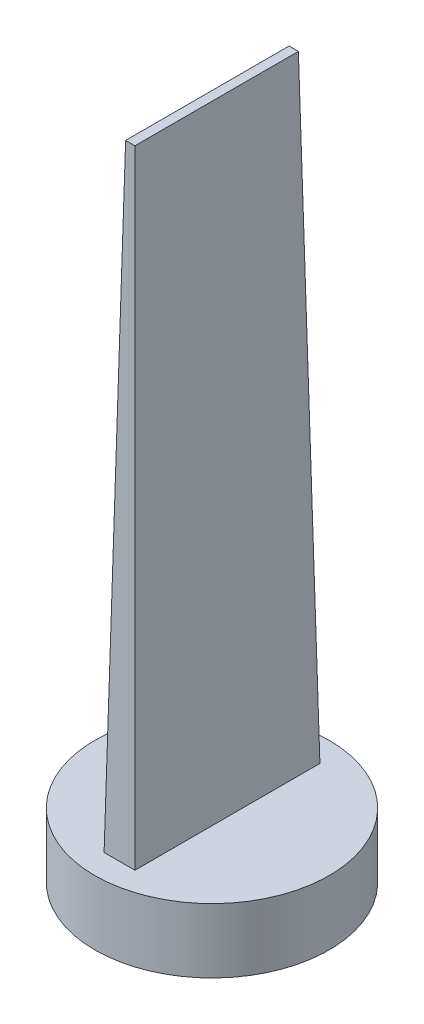
ISO-10303-21;
HEADER;
FILE_DESCRIPTION(('STEP AP214'),'2;1');
FILE_NAME('part.step','',(''),(''),'','','');
FILE_SCHEMA(('AUTOMOTIVE_DESIGN { 1 0 10303 214 1 1 1 1 }'));
ENDSEC;
DATA;
#1=APPLICATION_CONTEXT('core data for automotive mechanical design processes');
#2=APPLICATION_PROTOCOL_DEFINITION('international standard','automotive_design',2000,#1);
#3=PRODUCT_CONTEXT('',#1,'mechanical');
#4=PRODUCT('Part','Part','',(#3));
#5=PRODUCT_RELATED_PRODUCT_CATEGORY('part','',(#4));
#6=PRODUCT_DEFINITION_FORMATION('','',#4);
#7=PRODUCT_DEFINITION_CONTEXT('part definition',#1,'design');
#8=PRODUCT_DEFINITION('design','',#6,#7);
#9=PRODUCT_DEFINITION_SHAPE('','',#8);
#10=(LENGTH_UNIT() NAMED_UNIT(*) SI_UNIT(.MILLI.,.METRE.));
#11=(NAMED_UNIT(*) PLANE_ANGLE_UNIT() SI_UNIT($,.RADIAN.));
#12=(NAMED_UNIT(*) SI_UNIT($,.STERADIAN.) SOLID_ANGLE_UNIT());
#13=UNCERTAINTY_MEASURE_WITH_UNIT(LENGTH_MEASURE(1.E-05),#10,'distance_accuracy_value','');
#14=(GEOMETRIC_REPRESENTATION_CONTEXT(3) GLOBAL_UNCERTAINTY_ASSIGNED_CONTEXT((#13)) GLOBAL_UNIT_ASSIGNED_CONTEXT((#10,
#11,#12)) REPRESENTATION_CONTEXT('',''));
#15=CARTESIAN_POINT('',(0.,0.,0.));
#16=DIRECTION('',(0.,0.,1.));
#17=DIRECTION('',(1.,0.,0.));
#18=AXIS2_PLACEMENT_3D('',#15,#16,#17);
#19=CARTESIAN_POINT('',(0.,10.45,0.));
#20=DIRECTION('',(0.,-1.,0.));
#21=DIRECTION('',(0.,0.,-1.));
#22=AXIS2_PLACEMENT_3D('',#19,#20,#21);
#23=CYLINDRICAL_SURFACE('',#22,19.);
#24=CARTESIAN_POINT('',(0.,10.45,0.));
#25=DIRECTION('',(0.,1.,0.));
#26=DIRECTION('',(0.,0.,1.));
#27=AXIS2_PLACEMENT_3D('',#24,#25,#26);
#28=CIRCLE('',#27,19.);
#29=CARTESIAN_POINT('',(0.,10.45,19.));
#30=VERTEX_POINT('',#29);
#31=EDGE_CURVE('E11',#30,#30,#28,.T.);
#32=ORIENTED_EDGE('',*,*,#31,.F.);
#33=EDGE_LOOP('',(#32));
#34=FACE_BOUND('',#33,.T.);
#35=CARTESIAN_POINT('',(0.,0.,0.));
#36=DIRECTION('',(0.,1.,0.));
#37=DIRECTION('',(0.,0.,1.));
#38=AXIS2_PLACEMENT_3D('',#35,#36,#37);
#39=CIRCLE('',#38,19.);
#40=CARTESIAN_POINT('',(0.,0.,19.));
#41=VERTEX_POINT('',#40);
#42=EDGE_CURVE('E36',#41,#41,#39,.T.);
#43=ORIENTED_EDGE('',*,*,#42,.T.);
#44=EDGE_LOOP('',(#43));
#45=FACE_BOUND('',#44,.T.);
#46=ADVANCED_FACE('F33',(#34,#45),#23,.T.);
#47=CARTESIAN_POINT('',(0.,10.45,0.));
#48=DIRECTION('',(0.,1.,0.));
#49=DIRECTION('',(0.,0.,1.));
#50=AXIS2_PLACEMENT_3D('',#47,#48,#49);
#51=PLANE('',#50);
#52=DIRECTION('',(1.,0.,0.));
#53=VECTOR('',#52,1.);
#54=CARTESIAN_POINT('',(2.5,10.45,15.));
#55=LINE('',#54,#53);
#56=CARTESIAN_POINT('',(-2.5,10.45,15.));
#57=VERTEX_POINT('',#56);
#58=CARTESIAN_POINT('',(2.5,10.45,15.));
#59=VERTEX_POINT('',#58);
#60=EDGE_CURVE('E47',#57,#59,#55,.T.);
#61=ORIENTED_EDGE('',*,*,#60,.F.);
#62=DIRECTION('',(0.,0.,1.));
#63=VECTOR('',#62,1.);
#64=CARTESIAN_POINT('',(-2.5,10.45,15.));
#65=LINE('',#64,#63);
#66=CARTESIAN_POINT('',(-2.5,10.45,-15.));
#67=VERTEX_POINT('',#66);
#68=EDGE_CURVE('E51',#67,#57,#65,.T.);
#69=ORIENTED_EDGE('',*,*,#68,.F.);
#70=DIRECTION('',(-1.,0.,0.));
#71=VECTOR('',#70,1.);
#72=CARTESIAN_POINT('',(2.5,10.45,-15.));
#73=LINE('',#72,#71);
#74=CARTESIAN_POINT('',(2.5,10.45,-15.));
#75=VERTEX_POINT('',#74);
#76=EDGE_CURVE('E68',#75,#67,#73,.T.);
#77=ORIENTED_EDGE('',*,*,#76,.F.);
#78=DIRECTION('',(0.,0.,-1.));
#79=VECTOR('',#78,1.);
#80=CARTESIAN_POINT('',(2.5,10.45,15.));
#81=LINE('',#80,#79);
#82=EDGE_CURVE('E72',#59,#75,#81,.T.);
#83=ORIENTED_EDGE('',*,*,#82,.F.);
#84=EDGE_LOOP('',(#61,#69,#77,#83));
#85=FACE_BOUND('',#84,.T.);
#86=ORIENTED_EDGE('',*,*,#31,.T.);
#87=EDGE_LOOP('',(#86));
#88=FACE_BOUND('',#87,.T.);
#89=ADVANCED_FACE('F70',(#85,#88),#51,.T.);
#90=CARTESIAN_POINT('',(0.,0.,0.));
#91=DIRECTION('',(0.,1.,0.));
#92=DIRECTION('',(0.,0.,1.));
#93=AXIS2_PLACEMENT_3D('',#90,#91,#92);
#94=PLANE('',#93);
#95=ORIENTED_EDGE('',*,*,#42,.F.);
#96=EDGE_LOOP('',(#95));
#97=FACE_BOUND('',#96,.T.);
#98=ADVANCED_FACE('F129',(#97),#94,.F.);
#99=CARTESIAN_POINT('',(2.5,10.45,15.));
#100=DIRECTION('',(0.,0.0174524064372835,0.999847695156391));
#101=DIRECTION('',(0.,-0.999847695156391,0.0174524064372835));
#102=AXIS2_PLACEMENT_3D('',#99,#100,#101);
#103=PLANE('',#102);
#104=ORIENTED_EDGE('',*,*,#60,.T.);
#105=DIRECTION('',(0.0174497491606827,-0.999695459881887,0.0174497491606827));
#106=VECTOR('',#105,1.);
#107=CARTESIAN_POINT('',(2.5,10.45,15.));
#108=LINE('',#107,#106);
#109=CARTESIAN_POINT('',(0.754493507178238,110.45,13.2544935071782));
#110=VERTEX_POINT('',#109);
#111=EDGE_CURVE('E85',#110,#59,#108,.T.);
#112=ORIENTED_EDGE('',*,*,#111,.F.);
#113=DIRECTION('',(-1.,0.,0.));
#114=VECTOR('',#113,1.);
#115=CARTESIAN_POINT('',(0.,110.45,13.2544935071782));
#116=LINE('',#115,#114);
#117=CARTESIAN_POINT('',(-0.754493507178238,110.45,13.2544935071782));
#118=VERTEX_POINT('',#117);
#119=EDGE_CURVE('E96',#118,#110,#116,.F.);
#120=ORIENTED_EDGE('',*,*,#119,.F.);
#121=DIRECTION('',(-0.0174497491606827,-0.999695459881887,0.0174497491606827));
#122=VECTOR('',#121,1.);
#123=CARTESIAN_POINT('',(-2.49847753127115,10.5372221750601,14.9984775312711));
#124=LINE('',#123,#122);
#125=EDGE_CURVE('E92',#118,#57,#124,.T.);
#126=ORIENTED_EDGE('',*,*,#125,.T.);
#127=EDGE_LOOP('',(#104,#112,#120,#126));
#128=FACE_BOUND('',#127,.T.);
#129=ADVANCED_FACE('F111',(#128),#103,.T.);
#130=CARTESIAN_POINT('',(2.5,10.45,15.));
#131=DIRECTION('',(0.999847695156391,0.0174524064372835,0.));
#132=DIRECTION('',(-0.0174524064372835,0.999847695156391,0.));
#133=AXIS2_PLACEMENT_3D('',#130,#131,#132);
#134=PLANE('',#133);
#135=ORIENTED_EDGE('',*,*,#82,.T.);
#136=DIRECTION('',(0.0174497491606827,-0.999695459881887,-0.0174497491606827));
#137=VECTOR('',#136,1.);
#138=CARTESIAN_POINT('',(2.5,10.45,-15.));
#139=LINE('',#138,#137);
#140=CARTESIAN_POINT('',(0.754493507178238,110.45,-13.2544935071782));
#141=VERTEX_POINT('',#140);
#142=EDGE_CURVE('E82',#141,#75,#139,.T.);
#143=ORIENTED_EDGE('',*,*,#142,.F.);
#144=DIRECTION('',(0.,0.,1.));
#145=VECTOR('',#144,1.);
#146=CARTESIAN_POINT('',(0.754493507178238,110.45,0.));
#147=LINE('',#146,#145);
#148=EDGE_CURVE('E99',#110,#141,#147,.F.);
#149=ORIENTED_EDGE('',*,*,#148,.F.);
#150=ORIENTED_EDGE('',*,*,#111,.T.);
#151=EDGE_LOOP('',(#135,#143,#149,#150));
#152=FACE_BOUND('',#151,.T.);
#153=ADVANCED_FACE('F81',(#152),#134,.T.);
#154=CARTESIAN_POINT('',(2.5,10.45,-15.));
#155=DIRECTION('',(0.,0.0174524064372835,-0.999847695156391));
#156=DIRECTION('',(0.,0.999847695156391,0.0174524064372835));
#157=AXIS2_PLACEMENT_3D('',#154,#155,#156);
#158=PLANE('',#157);
#159=ORIENTED_EDGE('',*,*,#76,.T.);
#160=DIRECTION('',(-0.0174497491606827,-0.999695459881887,-0.0174497491606827));
#161=VECTOR('',#160,1.);
#162=CARTESIAN_POINT('',(-2.49086518762688,10.9733330503604,-14.9908651876269));
#163=LINE('',#162,#161);
#164=CARTESIAN_POINT('',(-0.754493507178238,110.45,-13.2544935071782));
#165=VERTEX_POINT('',#164);
#166=EDGE_CURVE('E89',#165,#67,#163,.T.);
#167=ORIENTED_EDGE('',*,*,#166,.F.);
#168=DIRECTION('',(1.,0.,0.));
#169=VECTOR('',#168,1.);
#170=CARTESIAN_POINT('',(0.,110.45,-13.2544935071782));
#171=LINE('',#170,#169);
#172=EDGE_CURVE('E88',#141,#165,#171,.F.);
#173=ORIENTED_EDGE('',*,*,#172,.F.);
#174=ORIENTED_EDGE('',*,*,#142,.T.);
#175=EDGE_LOOP('',(#159,#167,#173,#174));
#176=FACE_BOUND('',#175,.T.);
#177=ADVANCED_FACE('F87',(#176),#158,.T.);
#178=CARTESIAN_POINT('',(-2.5,10.45,15.));
#179=DIRECTION('',(-0.999847695156391,0.0174524064372835,0.));
#180=DIRECTION('',(-0.0174524064372835,-0.999847695156391,0.));
#181=AXIS2_PLACEMENT_3D('',#178,#179,#180);
#182=PLANE('',#181);
#183=ORIENTED_EDGE('',*,*,#68,.T.);
#184=ORIENTED_EDGE('',*,*,#125,.F.);
#185=DIRECTION('',(0.,0.,-1.));
#186=VECTOR('',#185,1.);
#187=CARTESIAN_POINT('',(-0.754493507178238,110.45,0.));
#188=LINE('',#187,#186);
#189=EDGE_CURVE('E102',#165,#118,#188,.F.);
#190=ORIENTED_EDGE('',*,*,#189,.F.);
#191=ORIENTED_EDGE('',*,*,#166,.T.);
#192=EDGE_LOOP('',(#183,#184,#190,#191));
#193=FACE_BOUND('',#192,.T.);
#194=ADVANCED_FACE('F114',(#193),#182,.T.);
#195=CARTESIAN_POINT('',(0.,110.45,0.));
#196=DIRECTION('',(0.,-1.,0.));
#197=DIRECTION('',(0.,0.,-1.));
#198=AXIS2_PLACEMENT_3D('',#195,#196,#197);
#199=PLANE('',#198);
#200=ORIENTED_EDGE('',*,*,#119,.T.);
#201=ORIENTED_EDGE('',*,*,#148,.T.);
#202=ORIENTED_EDGE('',*,*,#172,.T.);
#203=ORIENTED_EDGE('',*,*,#189,.T.);
#204=EDGE_LOOP('',(#200,#201,#202,#203));
#205=FACE_BOUND('',#204,.T.);
#206=ADVANCED_FACE('F112',(#205),#199,.F.);
#207=CLOSED_SHELL('',(#46,#89,#98,#129,#153,#177,#194,#206));
#208=MANIFOLD_SOLID_BREP('B2',#207);
#209=ADVANCED_BREP_SHAPE_REPRESENTATION('',(#18,#208),#14);
#210=SHAPE_DEFINITION_REPRESENTATION(#9,#209);
ENDSEC;
END-ISO-10303-21;
